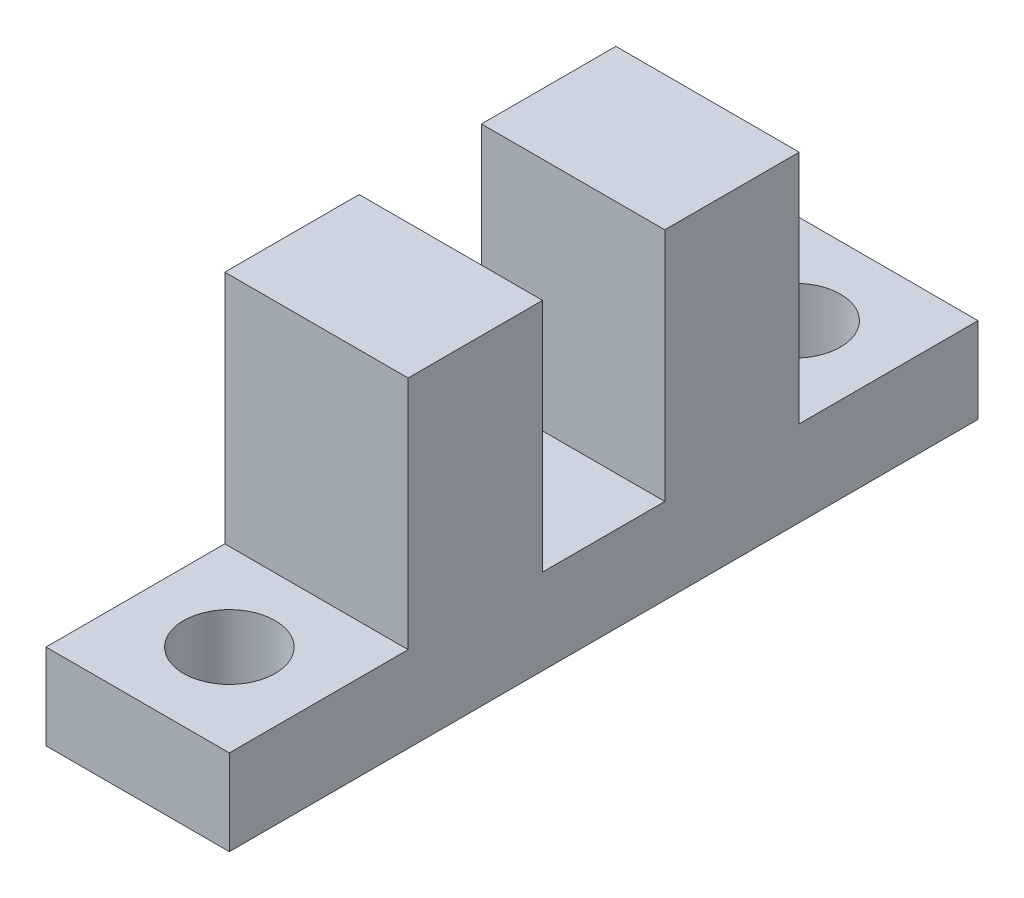
ISO-10303-21;
HEADER;
FILE_DESCRIPTION(('STEP AP214'),'2;1');
FILE_NAME('part.step','',(''),(''),'','','');
FILE_SCHEMA(('AUTOMOTIVE_DESIGN { 1 0 10303 214 1 1 1 1 }'));
ENDSEC;
DATA;
#1=APPLICATION_CONTEXT('core data for automotive mechanical design processes');
#2=APPLICATION_PROTOCOL_DEFINITION('international standard','automotive_design',2000,#1);
#3=PRODUCT_CONTEXT('',#1,'mechanical');
#4=PRODUCT('Part','Part','',(#3));
#5=PRODUCT_RELATED_PRODUCT_CATEGORY('part','',(#4));
#6=PRODUCT_DEFINITION_FORMATION('','',#4);
#7=PRODUCT_DEFINITION_CONTEXT('part definition',#1,'design');
#8=PRODUCT_DEFINITION('design','',#6,#7);
#9=PRODUCT_DEFINITION_SHAPE('','',#8);
#10=(LENGTH_UNIT() NAMED_UNIT(*) SI_UNIT(.MILLI.,.METRE.));
#11=(NAMED_UNIT(*) PLANE_ANGLE_UNIT() SI_UNIT($,.RADIAN.));
#12=(NAMED_UNIT(*) SI_UNIT($,.STERADIAN.) SOLID_ANGLE_UNIT());
#13=UNCERTAINTY_MEASURE_WITH_UNIT(LENGTH_MEASURE(1.E-05),#10,'distance_accuracy_value','');
#14=(GEOMETRIC_REPRESENTATION_CONTEXT(3) GLOBAL_UNCERTAINTY_ASSIGNED_CONTEXT((#13)) GLOBAL_UNIT_ASSIGNED_CONTEXT((#10,
#11,#12)) REPRESENTATION_CONTEXT('',''));
#15=CARTESIAN_POINT('',(0.,0.,0.));
#16=DIRECTION('',(0.,0.,1.));
#17=DIRECTION('',(1.,0.,0.));
#18=AXIS2_PLACEMENT_3D('',#15,#16,#17);
#19=CARTESIAN_POINT('',(6.,2.8,-6.4));
#20=DIRECTION('',(0.,-1.,0.));
#21=DIRECTION('',(0.,0.,-1.));
#22=AXIS2_PLACEMENT_3D('',#19,#20,#21);
#23=PLANE('',#22);
#24=CARTESIAN_POINT('',(3.,2.8,-9.25));
#25=DIRECTION('',(0.,1.,0.));
#26=DIRECTION('',(0.,0.,1.));
#27=AXIS2_PLACEMENT_3D('',#24,#25,#26);
#28=CIRCLE('',#27,1.5);
#29=CARTESIAN_POINT('',(3.,2.8,-7.75));
#30=VERTEX_POINT('',#29);
#31=EDGE_CURVE('E262',#30,#30,#28,.T.);
#32=ORIENTED_EDGE('',*,*,#31,.F.);
#33=EDGE_LOOP('',(#32));
#34=FACE_BOUND('',#33,.T.);
#35=DIRECTION('',(0.,0.,1.));
#36=VECTOR('',#35,1.);
#37=CARTESIAN_POINT('',(0.,2.8,-6.4));
#38=LINE('',#37,#36);
#39=CARTESIAN_POINT('',(0.,2.8,-12.25));
#40=VERTEX_POINT('',#39);
#41=CARTESIAN_POINT('',(0.,2.8,-6.4));
#42=VERTEX_POINT('',#41);
#43=EDGE_CURVE('E153',#40,#42,#38,.T.);
#44=ORIENTED_EDGE('',*,*,#43,.T.);
#45=DIRECTION('',(-1.,0.,0.));
#46=VECTOR('',#45,1.);
#47=CARTESIAN_POINT('',(6.,2.8,-6.4));
#48=LINE('',#47,#46);
#49=CARTESIAN_POINT('',(6.,2.8,-6.4));
#50=VERTEX_POINT('',#49);
#51=EDGE_CURVE('E11',#50,#42,#48,.T.);
#52=ORIENTED_EDGE('',*,*,#51,.F.);
#53=DIRECTION('',(0.,0.,1.));
#54=VECTOR('',#53,1.);
#55=CARTESIAN_POINT('',(6.,2.8,-6.4));
#56=LINE('',#55,#54);
#57=CARTESIAN_POINT('',(6.,2.8,-12.25));
#58=VERTEX_POINT('',#57);
#59=EDGE_CURVE('E176',#58,#50,#56,.T.);
#60=ORIENTED_EDGE('',*,*,#59,.F.);
#61=DIRECTION('',(-1.,0.,0.));
#62=VECTOR('',#61,1.);
#63=CARTESIAN_POINT('',(6.,2.8,-12.25));
#64=LINE('',#63,#62);
#65=EDGE_CURVE('E149',#58,#40,#64,.T.);
#66=ORIENTED_EDGE('',*,*,#65,.T.);
#67=EDGE_LOOP('',(#44,#52,#60,#66));
#68=FACE_BOUND('',#67,.T.);
#69=ADVANCED_FACE('F33',(#34,#68),#23,.F.);
#70=CARTESIAN_POINT('',(6.,2.8,-6.4));
#71=DIRECTION('',(0.,0.,1.));
#72=DIRECTION('',(1.,0.,0.));
#73=AXIS2_PLACEMENT_3D('',#70,#71,#72);
#74=PLANE('',#73);
#75=DIRECTION('',(0.,1.,0.));
#76=VECTOR('',#75,1.);
#77=CARTESIAN_POINT('',(0.,2.8,-6.4));
#78=LINE('',#77,#76);
#79=CARTESIAN_POINT('',(0.,10.5,-6.4));
#80=VERTEX_POINT('',#79);
#81=EDGE_CURVE('E156',#42,#80,#78,.T.);
#82=ORIENTED_EDGE('',*,*,#81,.T.);
#83=DIRECTION('',(-1.,0.,0.));
#84=VECTOR('',#83,1.);
#85=CARTESIAN_POINT('',(6.,10.5,-6.4));
#86=LINE('',#85,#84);
#87=CARTESIAN_POINT('',(6.,10.5,-6.4));
#88=VERTEX_POINT('',#87);
#89=EDGE_CURVE('E41',#88,#80,#86,.T.);
#90=ORIENTED_EDGE('',*,*,#89,.F.);
#91=DIRECTION('',(0.,1.,0.));
#92=VECTOR('',#91,1.);
#93=CARTESIAN_POINT('',(6.,2.8,-6.4));
#94=LINE('',#93,#92);
#95=EDGE_CURVE('E104',#50,#88,#94,.T.);
#96=ORIENTED_EDGE('',*,*,#95,.F.);
#97=ORIENTED_EDGE('',*,*,#51,.T.);
#98=EDGE_LOOP('',(#82,#90,#96,#97));
#99=FACE_BOUND('',#98,.T.);
#100=ADVANCED_FACE('F255',(#99),#74,.F.);
#101=CARTESIAN_POINT('',(6.,10.5,-2.));
#102=DIRECTION('',(0.,-1.,0.));
#103=DIRECTION('',(0.,0.,-1.));
#104=AXIS2_PLACEMENT_3D('',#101,#102,#103);
#105=PLANE('',#104);
#106=DIRECTION('',(0.,0.,1.));
#107=VECTOR('',#106,1.);
#108=CARTESIAN_POINT('',(0.,10.5,-2.));
#109=LINE('',#108,#107);
#110=CARTESIAN_POINT('',(0.,10.5,-2.));
#111=VERTEX_POINT('',#110);
#112=EDGE_CURVE('E159',#80,#111,#109,.T.);
#113=ORIENTED_EDGE('',*,*,#112,.T.);
#114=DIRECTION('',(-1.,0.,0.));
#115=VECTOR('',#114,1.);
#116=CARTESIAN_POINT('',(6.,10.5,-2.));
#117=LINE('',#116,#115);
#118=CARTESIAN_POINT('',(6.,10.5,-2.));
#119=VERTEX_POINT('',#118);
#120=EDGE_CURVE('E195',#119,#111,#117,.T.);
#121=ORIENTED_EDGE('',*,*,#120,.F.);
#122=DIRECTION('',(0.,0.,1.));
#123=VECTOR('',#122,1.);
#124=CARTESIAN_POINT('',(6.,10.5,-2.));
#125=LINE('',#124,#123);
#126=EDGE_CURVE('E203',#88,#119,#125,.T.);
#127=ORIENTED_EDGE('',*,*,#126,.F.);
#128=ORIENTED_EDGE('',*,*,#89,.T.);
#129=EDGE_LOOP('',(#113,#121,#127,#128));
#130=FACE_BOUND('',#129,.T.);
#131=ADVANCED_FACE('F201',(#130),#105,.F.);
#132=CARTESIAN_POINT('',(6.,2.8,-2.));
#133=DIRECTION('',(0.,0.,-1.));
#134=DIRECTION('',(0.,1.,0.));
#135=AXIS2_PLACEMENT_3D('',#132,#133,#134);
#136=PLANE('',#135);
#137=DIRECTION('',(0.,-1.,0.));
#138=VECTOR('',#137,1.);
#139=CARTESIAN_POINT('',(0.,2.8,-2.));
#140=LINE('',#139,#138);
#141=CARTESIAN_POINT('',(0.,2.8,-2.));
#142=VERTEX_POINT('',#141);
#143=EDGE_CURVE('E161',#111,#142,#140,.T.);
#144=ORIENTED_EDGE('',*,*,#143,.T.);
#145=DIRECTION('',(-1.,0.,0.));
#146=VECTOR('',#145,1.);
#147=CARTESIAN_POINT('',(6.,2.8,-2.));
#148=LINE('',#147,#146);
#149=CARTESIAN_POINT('',(6.,2.8,-2.));
#150=VERTEX_POINT('',#149);
#151=EDGE_CURVE('E192',#150,#142,#148,.T.);
#152=ORIENTED_EDGE('',*,*,#151,.F.);
#153=DIRECTION('',(0.,-1.,0.));
#154=VECTOR('',#153,1.);
#155=CARTESIAN_POINT('',(6.,2.8,-2.));
#156=LINE('',#155,#154);
#157=EDGE_CURVE('E221',#119,#150,#156,.T.);
#158=ORIENTED_EDGE('',*,*,#157,.F.);
#159=ORIENTED_EDGE('',*,*,#120,.T.);
#160=EDGE_LOOP('',(#144,#152,#158,#159));
#161=FACE_BOUND('',#160,.T.);
#162=ADVANCED_FACE('F212',(#161),#136,.F.);
#163=CARTESIAN_POINT('',(6.,2.8,2.));
#164=DIRECTION('',(0.,-1.,0.));
#165=DIRECTION('',(0.,0.,-1.));
#166=AXIS2_PLACEMENT_3D('',#163,#164,#165);
#167=PLANE('',#166);
#168=DIRECTION('',(0.,0.,1.));
#169=VECTOR('',#168,1.);
#170=CARTESIAN_POINT('',(0.,2.8,2.));
#171=LINE('',#170,#169);
#172=CARTESIAN_POINT('',(0.,2.8,2.));
#173=VERTEX_POINT('',#172);
#174=EDGE_CURVE('E163',#142,#173,#171,.T.);
#175=ORIENTED_EDGE('',*,*,#174,.T.);
#176=DIRECTION('',(-1.,0.,0.));
#177=VECTOR('',#176,1.);
#178=CARTESIAN_POINT('',(6.,2.8,2.));
#179=LINE('',#178,#177);
#180=CARTESIAN_POINT('',(6.,2.8,2.));
#181=VERTEX_POINT('',#180);
#182=EDGE_CURVE('E189',#181,#173,#179,.T.);
#183=ORIENTED_EDGE('',*,*,#182,.F.);
#184=DIRECTION('',(0.,0.,1.));
#185=VECTOR('',#184,1.);
#186=CARTESIAN_POINT('',(6.,2.8,2.));
#187=LINE('',#186,#185);
#188=EDGE_CURVE('E218',#150,#181,#187,.T.);
#189=ORIENTED_EDGE('',*,*,#188,.F.);
#190=ORIENTED_EDGE('',*,*,#151,.T.);
#191=EDGE_LOOP('',(#175,#183,#189,#190));
#192=FACE_BOUND('',#191,.T.);
#193=ADVANCED_FACE('F216',(#192),#167,.F.);
#194=CARTESIAN_POINT('',(6.,2.8,2.));
#195=DIRECTION('',(0.,0.,1.));
#196=DIRECTION('',(0.,-1.,0.));
#197=AXIS2_PLACEMENT_3D('',#194,#195,#196);
#198=PLANE('',#197);
#199=DIRECTION('',(0.,1.,0.));
#200=VECTOR('',#199,1.);
#201=CARTESIAN_POINT('',(0.,2.8,2.));
#202=LINE('',#201,#200);
#203=CARTESIAN_POINT('',(0.,10.5,2.));
#204=VERTEX_POINT('',#203);
#205=EDGE_CURVE('E165',#173,#204,#202,.T.);
#206=ORIENTED_EDGE('',*,*,#205,.T.);
#207=DIRECTION('',(-1.,0.,0.));
#208=VECTOR('',#207,1.);
#209=CARTESIAN_POINT('',(6.,10.5,2.));
#210=LINE('',#209,#208);
#211=CARTESIAN_POINT('',(6.,10.5,2.));
#212=VERTEX_POINT('',#211);
#213=EDGE_CURVE('E186',#212,#204,#210,.T.);
#214=ORIENTED_EDGE('',*,*,#213,.F.);
#215=DIRECTION('',(0.,1.,0.));
#216=VECTOR('',#215,1.);
#217=CARTESIAN_POINT('',(6.,2.8,2.));
#218=LINE('',#217,#216);
#219=EDGE_CURVE('E220',#181,#212,#218,.T.);
#220=ORIENTED_EDGE('',*,*,#219,.F.);
#221=ORIENTED_EDGE('',*,*,#182,.T.);
#222=EDGE_LOOP('',(#206,#214,#220,#221));
#223=FACE_BOUND('',#222,.T.);
#224=ADVANCED_FACE('F353',(#223),#198,.F.);
#225=CARTESIAN_POINT('',(6.,10.5,2.));
#226=DIRECTION('',(0.,-1.,0.));
#227=DIRECTION('',(0.,0.,-1.));
#228=AXIS2_PLACEMENT_3D('',#225,#226,#227);
#229=PLANE('',#228);
#230=DIRECTION('',(0.,0.,1.));
#231=VECTOR('',#230,1.);
#232=CARTESIAN_POINT('',(0.,10.5,2.));
#233=LINE('',#232,#231);
#234=CARTESIAN_POINT('',(0.,10.5,6.4));
#235=VERTEX_POINT('',#234);
#236=EDGE_CURVE('E167',#204,#235,#233,.T.);
#237=ORIENTED_EDGE('',*,*,#236,.T.);
#238=DIRECTION('',(-1.,0.,0.));
#239=VECTOR('',#238,1.);
#240=CARTESIAN_POINT('',(6.,10.5,6.4));
#241=LINE('',#240,#239);
#242=CARTESIAN_POINT('',(6.,10.5,6.4));
#243=VERTEX_POINT('',#242);
#244=EDGE_CURVE('E183',#243,#235,#241,.T.);
#245=ORIENTED_EDGE('',*,*,#244,.F.);
#246=DIRECTION('',(0.,0.,1.));
#247=VECTOR('',#246,1.);
#248=CARTESIAN_POINT('',(6.,10.5,2.));
#249=LINE('',#248,#247);
#250=EDGE_CURVE('E223',#212,#243,#249,.T.);
#251=ORIENTED_EDGE('',*,*,#250,.F.);
#252=ORIENTED_EDGE('',*,*,#213,.T.);
#253=EDGE_LOOP('',(#237,#245,#251,#252));
#254=FACE_BOUND('',#253,.T.);
#255=ADVANCED_FACE('F344',(#254),#229,.F.);
#256=CARTESIAN_POINT('',(6.,2.8,6.4));
#257=DIRECTION('',(0.,0.,-1.));
#258=DIRECTION('',(-1.,0.,0.));
#259=AXIS2_PLACEMENT_3D('',#256,#257,#258);
#260=PLANE('',#259);
#261=DIRECTION('',(0.,-1.,0.));
#262=VECTOR('',#261,1.);
#263=CARTESIAN_POINT('',(0.,2.8,6.4));
#264=LINE('',#263,#262);
#265=CARTESIAN_POINT('',(0.,2.8,6.4));
#266=VERTEX_POINT('',#265);
#267=EDGE_CURVE('E169',#235,#266,#264,.T.);
#268=ORIENTED_EDGE('',*,*,#267,.T.);
#269=DIRECTION('',(-1.,0.,0.));
#270=VECTOR('',#269,1.);
#271=CARTESIAN_POINT('',(6.,2.8,6.4));
#272=LINE('',#271,#270);
#273=CARTESIAN_POINT('',(6.,2.8,6.4));
#274=VERTEX_POINT('',#273);
#275=EDGE_CURVE('E180',#274,#266,#272,.T.);
#276=ORIENTED_EDGE('',*,*,#275,.F.);
#277=DIRECTION('',(0.,-1.,0.));
#278=VECTOR('',#277,1.);
#279=CARTESIAN_POINT('',(6.,2.8,6.4));
#280=LINE('',#279,#278);
#281=EDGE_CURVE('E229',#243,#274,#280,.T.);
#282=ORIENTED_EDGE('',*,*,#281,.F.);
#283=ORIENTED_EDGE('',*,*,#244,.T.);
#284=EDGE_LOOP('',(#268,#276,#282,#283));
#285=FACE_BOUND('',#284,.T.);
#286=ADVANCED_FACE('F235',(#285),#260,.F.);
#287=CARTESIAN_POINT('',(6.,2.8,12.25));
#288=DIRECTION('',(0.,-1.,0.));
#289=DIRECTION('',(0.,0.,-1.));
#290=AXIS2_PLACEMENT_3D('',#287,#288,#289);
#291=PLANE('',#290);
#292=CARTESIAN_POINT('',(3.,2.8,9.25));
#293=DIRECTION('',(0.,-1.,0.));
#294=DIRECTION('',(0.,0.,-1.));
#295=AXIS2_PLACEMENT_3D('',#292,#293,#294);
#296=CIRCLE('',#295,1.5);
#297=CARTESIAN_POINT('',(3.,2.8,7.75));
#298=VERTEX_POINT('',#297);
#299=EDGE_CURVE('E269',#298,#298,#296,.T.);
#300=ORIENTED_EDGE('',*,*,#299,.T.);
#301=EDGE_LOOP('',(#300));
#302=FACE_BOUND('',#301,.T.);
#303=DIRECTION('',(0.,0.,1.));
#304=VECTOR('',#303,1.);
#305=CARTESIAN_POINT('',(0.,2.8,12.25));
#306=LINE('',#305,#304);
#307=CARTESIAN_POINT('',(0.,2.8,12.25));
#308=VERTEX_POINT('',#307);
#309=EDGE_CURVE('E171',#266,#308,#306,.T.);
#310=ORIENTED_EDGE('',*,*,#309,.T.);
#311=DIRECTION('',(-1.,0.,0.));
#312=VECTOR('',#311,1.);
#313=CARTESIAN_POINT('',(6.,2.8,12.25));
#314=LINE('',#313,#312);
#315=CARTESIAN_POINT('',(6.,2.8,12.25));
#316=VERTEX_POINT('',#315);
#317=EDGE_CURVE('E144',#316,#308,#314,.T.);
#318=ORIENTED_EDGE('',*,*,#317,.F.);
#319=DIRECTION('',(0.,0.,1.));
#320=VECTOR('',#319,1.);
#321=CARTESIAN_POINT('',(6.,2.8,12.25));
#322=LINE('',#321,#320);
#323=EDGE_CURVE('E135',#274,#316,#322,.T.);
#324=ORIENTED_EDGE('',*,*,#323,.F.);
#325=ORIENTED_EDGE('',*,*,#275,.T.);
#326=EDGE_LOOP('',(#310,#318,#324,#325));
#327=FACE_BOUND('',#326,.T.);
#328=ADVANCED_FACE('F239',(#302,#327),#291,.F.);
#329=CARTESIAN_POINT('',(6.,0.,12.25));
#330=DIRECTION('',(0.,0.,-1.));
#331=DIRECTION('',(0.,1.,0.));
#332=AXIS2_PLACEMENT_3D('',#329,#330,#331);
#333=PLANE('',#332);
#334=DIRECTION('',(0.,-1.,0.));
#335=VECTOR('',#334,1.);
#336=CARTESIAN_POINT('',(0.,0.,12.25));
#337=LINE('',#336,#335);
#338=CARTESIAN_POINT('',(0.,0.,12.25));
#339=VERTEX_POINT('',#338);
#340=EDGE_CURVE('E143',#308,#339,#337,.T.);
#341=ORIENTED_EDGE('',*,*,#340,.T.);
#342=DIRECTION('',(-1.,0.,0.));
#343=VECTOR('',#342,1.);
#344=CARTESIAN_POINT('',(6.,0.,12.25));
#345=LINE('',#344,#343);
#346=CARTESIAN_POINT('',(6.,0.,12.25));
#347=VERTEX_POINT('',#346);
#348=EDGE_CURVE('E140',#347,#339,#345,.T.);
#349=ORIENTED_EDGE('',*,*,#348,.F.);
#350=DIRECTION('',(0.,-1.,0.));
#351=VECTOR('',#350,1.);
#352=CARTESIAN_POINT('',(6.,0.,12.25));
#353=LINE('',#352,#351);
#354=EDGE_CURVE('E129',#316,#347,#353,.T.);
#355=ORIENTED_EDGE('',*,*,#354,.F.);
#356=ORIENTED_EDGE('',*,*,#317,.T.);
#357=EDGE_LOOP('',(#341,#349,#355,#356));
#358=FACE_BOUND('',#357,.T.);
#359=ADVANCED_FACE('F141',(#358),#333,.F.);
#360=CARTESIAN_POINT('',(6.,0.,12.25));
#361=DIRECTION('',(0.,1.,0.));
#362=DIRECTION('',(0.,0.,1.));
#363=AXIS2_PLACEMENT_3D('',#360,#361,#362);
#364=PLANE('',#363);
#365=CARTESIAN_POINT('',(3.,0.,9.25));
#366=DIRECTION('',(0.,-1.,0.));
#367=DIRECTION('',(0.,0.,-1.));
#368=AXIS2_PLACEMENT_3D('',#365,#366,#367);
#369=CIRCLE('',#368,1.5);
#370=CARTESIAN_POINT('',(3.,0.,7.75));
#371=VERTEX_POINT('',#370);
#372=EDGE_CURVE('E264',#371,#371,#369,.T.);
#373=ORIENTED_EDGE('',*,*,#372,.F.);
#374=EDGE_LOOP('',(#373));
#375=FACE_BOUND('',#374,.T.);
#376=CARTESIAN_POINT('',(3.,0.,-9.25));
#377=DIRECTION('',(0.,1.,0.));
#378=DIRECTION('',(0.,0.,1.));
#379=AXIS2_PLACEMENT_3D('',#376,#377,#378);
#380=CIRCLE('',#379,1.5);
#381=CARTESIAN_POINT('',(3.,0.,-7.75));
#382=VERTEX_POINT('',#381);
#383=EDGE_CURVE('E157',#382,#382,#380,.T.);
#384=ORIENTED_EDGE('',*,*,#383,.T.);
#385=EDGE_LOOP('',(#384));
#386=FACE_BOUND('',#385,.T.);
#387=DIRECTION('',(0.,0.,-1.));
#388=VECTOR('',#387,1.);
#389=CARTESIAN_POINT('',(0.,0.,12.25));
#390=LINE('',#389,#388);
#391=CARTESIAN_POINT('',(0.,0.,-12.25));
#392=VERTEX_POINT('',#391);
#393=EDGE_CURVE('E90',#339,#392,#390,.T.);
#394=ORIENTED_EDGE('',*,*,#393,.T.);
#395=DIRECTION('',(-1.,0.,0.));
#396=VECTOR('',#395,1.);
#397=CARTESIAN_POINT('',(6.,0.,-12.25));
#398=LINE('',#397,#396);
#399=CARTESIAN_POINT('',(6.,0.,-12.25));
#400=VERTEX_POINT('',#399);
#401=EDGE_CURVE('E145',#400,#392,#398,.T.);
#402=ORIENTED_EDGE('',*,*,#401,.F.);
#403=DIRECTION('',(0.,0.,-1.));
#404=VECTOR('',#403,1.);
#405=CARTESIAN_POINT('',(6.,0.,12.25));
#406=LINE('',#405,#404);
#407=EDGE_CURVE('E133',#347,#400,#406,.T.);
#408=ORIENTED_EDGE('',*,*,#407,.F.);
#409=ORIENTED_EDGE('',*,*,#348,.T.);
#410=EDGE_LOOP('',(#394,#402,#408,#409));
#411=FACE_BOUND('',#410,.T.);
#412=ADVANCED_FACE('F147',(#375,#386,#411),#364,.F.);
#413=CARTESIAN_POINT('',(6.,0.,-12.25));
#414=DIRECTION('',(0.,0.,1.));
#415=DIRECTION('',(0.,-1.,0.));
#416=AXIS2_PLACEMENT_3D('',#413,#414,#415);
#417=PLANE('',#416);
#418=DIRECTION('',(0.,1.,0.));
#419=VECTOR('',#418,1.);
#420=CARTESIAN_POINT('',(0.,0.,-12.25));
#421=LINE('',#420,#419);
#422=EDGE_CURVE('E96',#392,#40,#421,.T.);
#423=ORIENTED_EDGE('',*,*,#422,.T.);
#424=ORIENTED_EDGE('',*,*,#65,.F.);
#425=DIRECTION('',(0.,1.,0.));
#426=VECTOR('',#425,1.);
#427=CARTESIAN_POINT('',(6.,0.,-12.25));
#428=LINE('',#427,#426);
#429=EDGE_CURVE('E49',#400,#58,#428,.T.);
#430=ORIENTED_EDGE('',*,*,#429,.F.);
#431=ORIENTED_EDGE('',*,*,#401,.T.);
#432=EDGE_LOOP('',(#423,#424,#430,#431));
#433=FACE_BOUND('',#432,.T.);
#434=ADVANCED_FACE('F243',(#433),#417,.F.);
#435=CARTESIAN_POINT('',(6.,0.,0.));
#436=DIRECTION('',(1.,0.,0.));
#437=DIRECTION('',(0.,0.,-1.));
#438=AXIS2_PLACEMENT_3D('',#435,#436,#437);
#439=PLANE('',#438);
#440=ORIENTED_EDGE('',*,*,#59,.T.);
#441=ORIENTED_EDGE('',*,*,#95,.T.);
#442=ORIENTED_EDGE('',*,*,#126,.T.);
#443=ORIENTED_EDGE('',*,*,#157,.T.);
#444=ORIENTED_EDGE('',*,*,#188,.T.);
#445=ORIENTED_EDGE('',*,*,#219,.T.);
#446=ORIENTED_EDGE('',*,*,#250,.T.);
#447=ORIENTED_EDGE('',*,*,#281,.T.);
#448=ORIENTED_EDGE('',*,*,#323,.T.);
#449=ORIENTED_EDGE('',*,*,#354,.T.);
#450=ORIENTED_EDGE('',*,*,#407,.T.);
#451=ORIENTED_EDGE('',*,*,#429,.T.);
#452=EDGE_LOOP('',(#440,#441,#442,#443,#444,#445,#446,#447,#448,#449,#450,#451));
#453=FACE_BOUND('',#452,.T.);
#454=ADVANCED_FACE('F131',(#453),#439,.T.);
#455=CARTESIAN_POINT('',(0.,0.,0.));
#456=DIRECTION('',(1.,0.,0.));
#457=DIRECTION('',(0.,0.,-1.));
#458=AXIS2_PLACEMENT_3D('',#455,#456,#457);
#459=PLANE('',#458);
#460=ORIENTED_EDGE('',*,*,#43,.F.);
#461=ORIENTED_EDGE('',*,*,#422,.F.);
#462=ORIENTED_EDGE('',*,*,#393,.F.);
#463=ORIENTED_EDGE('',*,*,#340,.F.);
#464=ORIENTED_EDGE('',*,*,#309,.F.);
#465=ORIENTED_EDGE('',*,*,#267,.F.);
#466=ORIENTED_EDGE('',*,*,#236,.F.);
#467=ORIENTED_EDGE('',*,*,#205,.F.);
#468=ORIENTED_EDGE('',*,*,#174,.F.);
#469=ORIENTED_EDGE('',*,*,#143,.F.);
#470=ORIENTED_EDGE('',*,*,#112,.F.);
#471=ORIENTED_EDGE('',*,*,#81,.F.);
#472=EDGE_LOOP('',(#460,#461,#462,#463,#464,#465,#466,#467,#468,#469,#470,#471));
#473=FACE_BOUND('',#472,.T.);
#474=ADVANCED_FACE('F207',(#473),#459,.F.);
#475=CARTESIAN_POINT('',(3.,0.,-9.25));
#476=DIRECTION('',(0.,1.,0.));
#477=DIRECTION('',(0.,0.,1.));
#478=AXIS2_PLACEMENT_3D('',#475,#476,#477);
#479=CYLINDRICAL_SURFACE('',#478,1.5);
#480=ORIENTED_EDGE('',*,*,#383,.F.);
#481=EDGE_LOOP('',(#480));
#482=FACE_BOUND('',#481,.T.);
#483=ORIENTED_EDGE('',*,*,#31,.T.);
#484=EDGE_LOOP('',(#483));
#485=FACE_BOUND('',#484,.T.);
#486=ADVANCED_FACE('F280',(#482,#485),#479,.F.);
#487=CARTESIAN_POINT('',(3.,0.,9.25));
#488=DIRECTION('',(0.,1.,0.));
#489=DIRECTION('',(0.,0.,1.));
#490=AXIS2_PLACEMENT_3D('',#487,#488,#489);
#491=CYLINDRICAL_SURFACE('',#490,1.5);
#492=ORIENTED_EDGE('',*,*,#372,.T.);
#493=EDGE_LOOP('',(#492));
#494=FACE_BOUND('',#493,.T.);
#495=ORIENTED_EDGE('',*,*,#299,.F.);
#496=EDGE_LOOP('',(#495));
#497=FACE_BOUND('',#496,.T.);
#498=ADVANCED_FACE('F278',(#494,#497),#491,.F.);
#499=CLOSED_SHELL('',(#69,#100,#131,#162,#193,#224,#255,#286,#328,#359,#412,#434,#454,#474,#486,#498));
#500=MANIFOLD_SOLID_BREP('B2',#499);
#501=ADVANCED_BREP_SHAPE_REPRESENTATION('',(#18,#500),#14);
#502=SHAPE_DEFINITION_REPRESENTATION(#9,#501);
ENDSEC;
END-ISO-10303-21;
